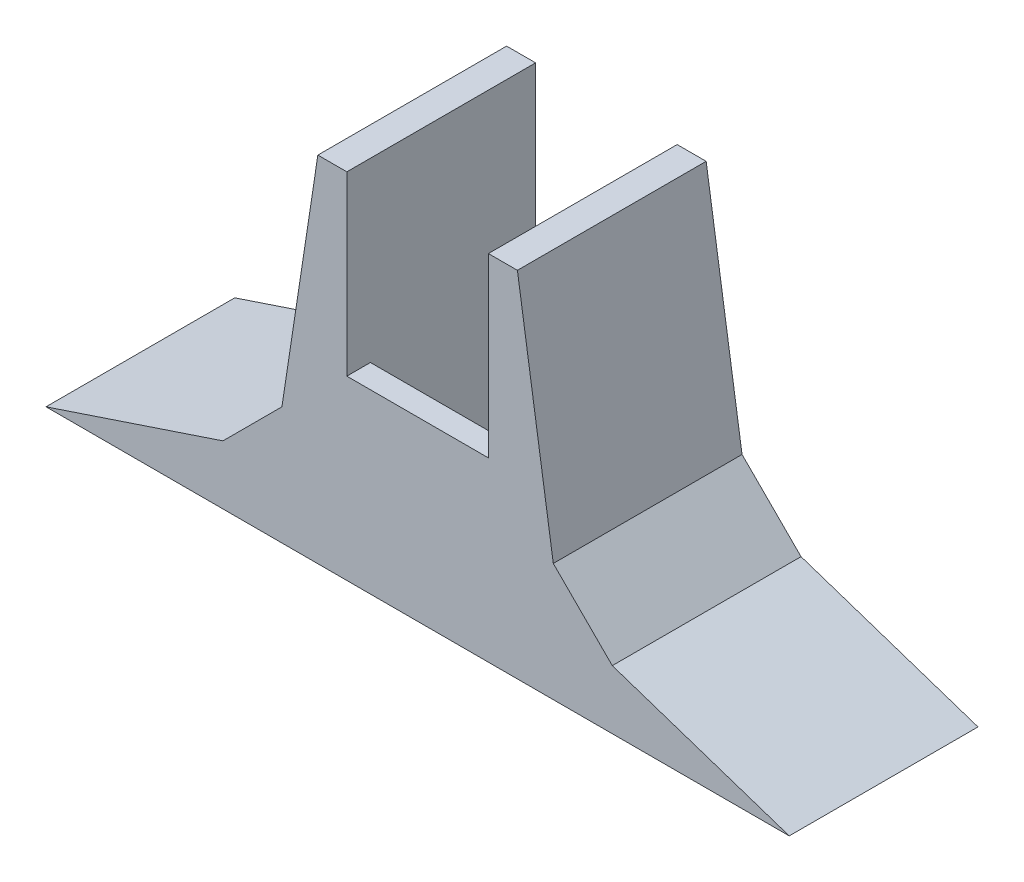
ISO-10303-21;
HEADER;
FILE_DESCRIPTION(('STEP AP214'),'2;1');
FILE_NAME('part.step','',(''),(''),'','','');
FILE_SCHEMA(('AUTOMOTIVE_DESIGN { 1 0 10303 214 1 1 1 1 }'));
ENDSEC;
DATA;
#1=APPLICATION_CONTEXT('core data for automotive mechanical design processes');
#2=APPLICATION_PROTOCOL_DEFINITION('international standard','automotive_design',2000,#1);
#3=PRODUCT_CONTEXT('',#1,'mechanical');
#4=PRODUCT('Part','Part','',(#3));
#5=PRODUCT_RELATED_PRODUCT_CATEGORY('part','',(#4));
#6=PRODUCT_DEFINITION_FORMATION('','',#4);
#7=PRODUCT_DEFINITION_CONTEXT('part definition',#1,'design');
#8=PRODUCT_DEFINITION('design','',#6,#7);
#9=PRODUCT_DEFINITION_SHAPE('','',#8);
#10=(LENGTH_UNIT() NAMED_UNIT(*) SI_UNIT(.MILLI.,.METRE.));
#11=(NAMED_UNIT(*) PLANE_ANGLE_UNIT() SI_UNIT($,.RADIAN.));
#12=(NAMED_UNIT(*) SI_UNIT($,.STERADIAN.) SOLID_ANGLE_UNIT());
#13=UNCERTAINTY_MEASURE_WITH_UNIT(LENGTH_MEASURE(1.E-05),#10,'distance_accuracy_value','');
#14=(GEOMETRIC_REPRESENTATION_CONTEXT(3) GLOBAL_UNCERTAINTY_ASSIGNED_CONTEXT((#13)) GLOBAL_UNIT_ASSIGNED_CONTEXT((#10,
#11,#12)) REPRESENTATION_CONTEXT('',''));
#15=CARTESIAN_POINT('',(0.,0.,0.));
#16=DIRECTION('',(0.,0.,1.));
#17=DIRECTION('',(1.,0.,0.));
#18=AXIS2_PLACEMENT_3D('',#15,#16,#17);
#19=CARTESIAN_POINT('',(-8.45753925141449,30.,16.));
#20=DIRECTION('',(0.,1.,0.));
#21=DIRECTION('',(0.,0.,1.));
#22=AXIS2_PLACEMENT_3D('',#19,#20,#21);
#23=PLANE('',#22);
#24=DIRECTION('',(1.,0.,0.));
#25=VECTOR('',#24,1.);
#26=CARTESIAN_POINT('',(-8.45753925141449,30.,16.));
#27=LINE('',#26,#25);
#28=CARTESIAN_POINT('',(-8.45753925141449,30.,16.));
#29=VERTEX_POINT('',#28);
#30=CARTESIAN_POINT('',(-6.,30.,16.));
#31=VERTEX_POINT('',#30);
#32=EDGE_CURVE('E242',#29,#31,#27,.T.);
#33=ORIENTED_EDGE('',*,*,#32,.T.);
#34=DIRECTION('',(0.,0.,-1.));
#35=VECTOR('',#34,1.);
#36=CARTESIAN_POINT('',(-6.,30.,14.));
#37=LINE('',#36,#35);
#38=CARTESIAN_POINT('',(-6.,30.,0.));
#39=VERTEX_POINT('',#38);
#40=EDGE_CURVE('E180',#31,#39,#37,.T.);
#41=ORIENTED_EDGE('',*,*,#40,.T.);
#42=DIRECTION('',(1.,0.,0.));
#43=VECTOR('',#42,1.);
#44=CARTESIAN_POINT('',(-8.45753925141449,30.,0.));
#45=LINE('',#44,#43);
#46=CARTESIAN_POINT('',(-8.45753925141449,30.,0.));
#47=VERTEX_POINT('',#46);
#48=EDGE_CURVE('E148',#47,#39,#45,.T.);
#49=ORIENTED_EDGE('',*,*,#48,.F.);
#50=DIRECTION('',(0.,0.,-1.));
#51=VECTOR('',#50,1.);
#52=CARTESIAN_POINT('',(-8.45753925141449,30.,16.));
#53=LINE('',#52,#51);
#54=EDGE_CURVE('E37',#29,#47,#53,.T.);
#55=ORIENTED_EDGE('',*,*,#54,.F.);
#56=EDGE_LOOP('',(#33,#41,#49,#55));
#57=FACE_BOUND('',#56,.T.);
#58=ADVANCED_FACE('F33',(#57),#23,.T.);
#59=CARTESIAN_POINT('',(0.,0.,16.));
#60=DIRECTION('',(0.,0.,-1.));
#61=DIRECTION('',(-1.,0.,0.));
#62=AXIS2_PLACEMENT_3D('',#59,#60,#61);
#63=PLANE('',#62);
#64=DIRECTION('',(0.,1.,0.));
#65=VECTOR('',#64,1.);
#66=CARTESIAN_POINT('',(-6.,0.,16.));
#67=LINE('',#66,#65);
#68=CARTESIAN_POINT('',(-6.,15.,16.));
#69=VERTEX_POINT('',#68);
#70=EDGE_CURVE('E237',#69,#31,#67,.T.);
#71=ORIENTED_EDGE('',*,*,#70,.T.);
#72=ORIENTED_EDGE('',*,*,#32,.F.);
#73=DIRECTION('',(0.150392838190402,0.988626316775472,0.));
#74=VECTOR('',#73,1.);
#75=CARTESIAN_POINT('',(-11.5,9.99999999999999,16.));
#76=LINE('',#75,#74);
#77=CARTESIAN_POINT('',(-11.5,9.99999999999999,16.));
#78=VERTEX_POINT('',#77);
#79=EDGE_CURVE('E163',#78,#29,#76,.T.);
#80=ORIENTED_EDGE('',*,*,#79,.F.);
#81=DIRECTION('',(0.707106781186548,0.707106781186547,0.));
#82=VECTOR('',#81,1.);
#83=CARTESIAN_POINT('',(-16.5,4.99999999999999,16.));
#84=LINE('',#83,#82);
#85=CARTESIAN_POINT('',(-16.5,4.99999999999999,16.));
#86=VERTEX_POINT('',#85);
#87=EDGE_CURVE('E132',#86,#78,#84,.T.);
#88=ORIENTED_EDGE('',*,*,#87,.F.);
#89=DIRECTION('',(0.948683298050514,0.316227766016838,0.));
#90=VECTOR('',#89,1.);
#91=CARTESIAN_POINT('',(-31.5,0.,16.));
#92=LINE('',#91,#90);
#93=CARTESIAN_POINT('',(-31.5,0.,16.));
#94=VERTEX_POINT('',#93);
#95=EDGE_CURVE('E117',#94,#86,#92,.T.);
#96=ORIENTED_EDGE('',*,*,#95,.F.);
#97=DIRECTION('',(-1.,0.,0.));
#98=VECTOR('',#97,1.);
#99=CARTESIAN_POINT('',(31.5,0.,16.));
#100=LINE('',#99,#98);
#101=CARTESIAN_POINT('',(31.5,0.,16.));
#102=VERTEX_POINT('',#101);
#103=EDGE_CURVE('E131',#102,#94,#100,.T.);
#104=ORIENTED_EDGE('',*,*,#103,.F.);
#105=DIRECTION('',(-0.948683298050514,0.316227766016838,0.));
#106=VECTOR('',#105,1.);
#107=CARTESIAN_POINT('',(31.5,0.,16.));
#108=LINE('',#107,#106);
#109=CARTESIAN_POINT('',(16.5,4.99999999999999,16.));
#110=VERTEX_POINT('',#109);
#111=EDGE_CURVE('E136',#102,#110,#108,.T.);
#112=ORIENTED_EDGE('',*,*,#111,.T.);
#113=DIRECTION('',(-0.707106781186548,0.707106781186547,0.));
#114=VECTOR('',#113,1.);
#115=CARTESIAN_POINT('',(16.5,4.99999999999999,16.));
#116=LINE('',#115,#114);
#117=CARTESIAN_POINT('',(11.5,9.99999999999999,16.));
#118=VERTEX_POINT('',#117);
#119=EDGE_CURVE('E138',#110,#118,#116,.T.);
#120=ORIENTED_EDGE('',*,*,#119,.T.);
#121=DIRECTION('',(-0.150392838190402,0.988626316775472,0.));
#122=VECTOR('',#121,1.);
#123=CARTESIAN_POINT('',(11.5,9.99999999999999,16.));
#124=LINE('',#123,#122);
#125=CARTESIAN_POINT('',(8.45753925141449,30.,16.));
#126=VERTEX_POINT('',#125);
#127=EDGE_CURVE('E241',#118,#126,#124,.T.);
#128=ORIENTED_EDGE('',*,*,#127,.T.);
#129=CARTESIAN_POINT('',(6.,30.,16.));
#130=VERTEX_POINT('',#129);
#131=EDGE_CURVE('E219',#130,#126,#27,.T.);
#132=ORIENTED_EDGE('',*,*,#131,.F.);
#133=DIRECTION('',(0.,1.,0.));
#134=VECTOR('',#133,1.);
#135=CARTESIAN_POINT('',(6.,0.,16.));
#136=LINE('',#135,#134);
#137=CARTESIAN_POINT('',(6.,15.,16.));
#138=VERTEX_POINT('',#137);
#139=EDGE_CURVE('E230',#138,#130,#136,.T.);
#140=ORIENTED_EDGE('',*,*,#139,.F.);
#141=DIRECTION('',(1.,0.,0.));
#142=VECTOR('',#141,1.);
#143=CARTESIAN_POINT('',(0.,15.,16.));
#144=LINE('',#143,#142);
#145=EDGE_CURVE('E238',#69,#138,#144,.T.);
#146=ORIENTED_EDGE('',*,*,#145,.F.);
#147=EDGE_LOOP('',(#71,#72,#80,#88,#96,#104,#112,#120,#128,#132,#140,#146));
#148=FACE_BOUND('',#147,.T.);
#149=ADVANCED_FACE('F130',(#148),#63,.F.);
#150=CARTESIAN_POINT('',(0.,0.,0.));
#151=DIRECTION('',(0.,0.,-1.));
#152=DIRECTION('',(-1.,0.,0.));
#153=AXIS2_PLACEMENT_3D('',#150,#151,#152);
#154=PLANE('',#153);
#155=ORIENTED_EDGE('',*,*,#48,.T.);
#156=DIRECTION('',(0.,-1.,0.));
#157=VECTOR('',#156,1.);
#158=CARTESIAN_POINT('',(-6.,0.,0.));
#159=LINE('',#158,#157);
#160=CARTESIAN_POINT('',(-6.,15.,0.));
#161=VERTEX_POINT('',#160);
#162=EDGE_CURVE('E226',#39,#161,#159,.T.);
#163=ORIENTED_EDGE('',*,*,#162,.T.);
#164=DIRECTION('',(-1.,0.,0.));
#165=VECTOR('',#164,1.);
#166=CARTESIAN_POINT('',(0.,15.,0.));
#167=LINE('',#166,#165);
#168=CARTESIAN_POINT('',(6.,15.,0.));
#169=VERTEX_POINT('',#168);
#170=EDGE_CURVE('E258',#169,#161,#167,.T.);
#171=ORIENTED_EDGE('',*,*,#170,.F.);
#172=DIRECTION('',(0.,-1.,0.));
#173=VECTOR('',#172,1.);
#174=CARTESIAN_POINT('',(6.,0.,0.));
#175=LINE('',#174,#173);
#176=CARTESIAN_POINT('',(6.,30.,0.));
#177=VERTEX_POINT('',#176);
#178=EDGE_CURVE('E255',#177,#169,#175,.T.);
#179=ORIENTED_EDGE('',*,*,#178,.F.);
#180=CARTESIAN_POINT('',(8.45753925141449,30.,0.));
#181=VERTEX_POINT('',#180);
#182=EDGE_CURVE('E146',#177,#181,#45,.T.);
#183=ORIENTED_EDGE('',*,*,#182,.T.);
#184=DIRECTION('',(-0.150392838190402,0.988626316775472,0.));
#185=VECTOR('',#184,1.);
#186=CARTESIAN_POINT('',(11.5,9.99999999999999,0.));
#187=LINE('',#186,#185);
#188=CARTESIAN_POINT('',(11.5,9.99999999999999,0.));
#189=VERTEX_POINT('',#188);
#190=EDGE_CURVE('E151',#189,#181,#187,.T.);
#191=ORIENTED_EDGE('',*,*,#190,.F.);
#192=DIRECTION('',(-0.707106781186548,0.707106781186547,0.));
#193=VECTOR('',#192,1.);
#194=CARTESIAN_POINT('',(16.5,4.99999999999999,0.));
#195=LINE('',#194,#193);
#196=CARTESIAN_POINT('',(16.5,4.99999999999999,0.));
#197=VERTEX_POINT('',#196);
#198=EDGE_CURVE('E154',#197,#189,#195,.T.);
#199=ORIENTED_EDGE('',*,*,#198,.F.);
#200=DIRECTION('',(-0.948683298050514,0.316227766016838,0.));
#201=VECTOR('',#200,1.);
#202=CARTESIAN_POINT('',(31.5,0.,0.));
#203=LINE('',#202,#201);
#204=CARTESIAN_POINT('',(31.5,0.,0.));
#205=VERTEX_POINT('',#204);
#206=EDGE_CURVE('E156',#205,#197,#203,.T.);
#207=ORIENTED_EDGE('',*,*,#206,.F.);
#208=DIRECTION('',(-1.,0.,0.));
#209=VECTOR('',#208,1.);
#210=CARTESIAN_POINT('',(31.5,0.,0.));
#211=LINE('',#210,#209);
#212=CARTESIAN_POINT('',(-31.5,0.,0.));
#213=VERTEX_POINT('',#212);
#214=EDGE_CURVE('E158',#205,#213,#211,.T.);
#215=ORIENTED_EDGE('',*,*,#214,.T.);
#216=DIRECTION('',(0.948683298050514,0.316227766016838,0.));
#217=VECTOR('',#216,1.);
#218=CARTESIAN_POINT('',(-31.5,0.,0.));
#219=LINE('',#218,#217);
#220=CARTESIAN_POINT('',(-16.5,4.99999999999999,0.));
#221=VERTEX_POINT('',#220);
#222=EDGE_CURVE('E120',#213,#221,#219,.T.);
#223=ORIENTED_EDGE('',*,*,#222,.T.);
#224=DIRECTION('',(0.707106781186548,0.707106781186547,0.));
#225=VECTOR('',#224,1.);
#226=CARTESIAN_POINT('',(-16.5,4.99999999999999,0.));
#227=LINE('',#226,#225);
#228=CARTESIAN_POINT('',(-11.5,9.99999999999999,0.));
#229=VERTEX_POINT('',#228);
#230=EDGE_CURVE('E161',#221,#229,#227,.T.);
#231=ORIENTED_EDGE('',*,*,#230,.T.);
#232=DIRECTION('',(0.150392838190402,0.988626316775472,0.));
#233=VECTOR('',#232,1.);
#234=CARTESIAN_POINT('',(-11.5,9.99999999999999,0.));
#235=LINE('',#234,#233);
#236=EDGE_CURVE('E143',#229,#47,#235,.T.);
#237=ORIENTED_EDGE('',*,*,#236,.T.);
#238=EDGE_LOOP('',(#155,#163,#171,#179,#183,#191,#199,#207,#215,#223,#231,#237));
#239=FACE_BOUND('',#238,.T.);
#240=ADVANCED_FACE('F184',(#239),#154,.T.);
#241=CARTESIAN_POINT('',(-11.5,9.99999999999999,16.));
#242=DIRECTION('',(-0.988626316775472,0.150392838190402,0.));
#243=DIRECTION('',(-0.150392838190402,-0.988626316775472,0.));
#244=AXIS2_PLACEMENT_3D('',#241,#242,#243);
#245=PLANE('',#244);
#246=ORIENTED_EDGE('',*,*,#236,.F.);
#247=DIRECTION('',(0.,0.,-1.));
#248=VECTOR('',#247,1.);
#249=CARTESIAN_POINT('',(-11.5,9.99999999999999,16.));
#250=LINE('',#249,#248);
#251=EDGE_CURVE('E11',#78,#229,#250,.T.);
#252=ORIENTED_EDGE('',*,*,#251,.F.);
#253=ORIENTED_EDGE('',*,*,#79,.T.);
#254=ORIENTED_EDGE('',*,*,#54,.T.);
#255=EDGE_LOOP('',(#246,#252,#253,#254));
#256=FACE_BOUND('',#255,.T.);
#257=ADVANCED_FACE('F35',(#256),#245,.T.);
#258=CARTESIAN_POINT('',(-16.5,4.99999999999999,16.));
#259=DIRECTION('',(-0.707106781186547,0.707106781186548,0.));
#260=DIRECTION('',(-0.707106781186548,-0.707106781186547,0.));
#261=AXIS2_PLACEMENT_3D('',#258,#259,#260);
#262=PLANE('',#261);
#263=ORIENTED_EDGE('',*,*,#230,.F.);
#264=DIRECTION('',(0.,0.,-1.));
#265=VECTOR('',#264,1.);
#266=CARTESIAN_POINT('',(-16.5,4.99999999999999,16.));
#267=LINE('',#266,#265);
#268=EDGE_CURVE('E42',#86,#221,#267,.T.);
#269=ORIENTED_EDGE('',*,*,#268,.F.);
#270=ORIENTED_EDGE('',*,*,#87,.T.);
#271=ORIENTED_EDGE('',*,*,#251,.T.);
#272=EDGE_LOOP('',(#263,#269,#270,#271));
#273=FACE_BOUND('',#272,.T.);
#274=ADVANCED_FACE('F185',(#273),#262,.T.);
#275=CARTESIAN_POINT('',(-31.5,0.,16.));
#276=DIRECTION('',(-0.316227766016838,0.948683298050514,0.));
#277=DIRECTION('',(-0.948683298050514,-0.316227766016838,0.));
#278=AXIS2_PLACEMENT_3D('',#275,#276,#277);
#279=PLANE('',#278);
#280=ORIENTED_EDGE('',*,*,#222,.F.);
#281=DIRECTION('',(0.,0.,-1.));
#282=VECTOR('',#281,1.);
#283=CARTESIAN_POINT('',(-31.5,0.,16.));
#284=LINE('',#283,#282);
#285=EDGE_CURVE('E114',#94,#213,#284,.T.);
#286=ORIENTED_EDGE('',*,*,#285,.F.);
#287=ORIENTED_EDGE('',*,*,#95,.T.);
#288=ORIENTED_EDGE('',*,*,#268,.T.);
#289=EDGE_LOOP('',(#280,#286,#287,#288));
#290=FACE_BOUND('',#289,.T.);
#291=ADVANCED_FACE('F116',(#290),#279,.T.);
#292=CARTESIAN_POINT('',(31.5,0.,16.));
#293=DIRECTION('',(0.,-1.,0.));
#294=DIRECTION('',(0.,0.,-1.));
#295=AXIS2_PLACEMENT_3D('',#292,#293,#294);
#296=PLANE('',#295);
#297=ORIENTED_EDGE('',*,*,#214,.F.);
#298=DIRECTION('',(0.,0.,-1.));
#299=VECTOR('',#298,1.);
#300=CARTESIAN_POINT('',(31.5,0.,16.));
#301=LINE('',#300,#299);
#302=EDGE_CURVE('E125',#102,#205,#301,.T.);
#303=ORIENTED_EDGE('',*,*,#302,.F.);
#304=ORIENTED_EDGE('',*,*,#103,.T.);
#305=ORIENTED_EDGE('',*,*,#285,.T.);
#306=EDGE_LOOP('',(#297,#303,#304,#305));
#307=FACE_BOUND('',#306,.T.);
#308=ADVANCED_FACE('F134',(#307),#296,.T.);
#309=CARTESIAN_POINT('',(31.5,0.,16.));
#310=DIRECTION('',(-0.316227766016838,-0.948683298050514,0.));
#311=DIRECTION('',(0.948683298050514,-0.316227766016838,0.));
#312=AXIS2_PLACEMENT_3D('',#309,#310,#311);
#313=PLANE('',#312);
#314=ORIENTED_EDGE('',*,*,#206,.T.);
#315=DIRECTION('',(0.,0.,-1.));
#316=VECTOR('',#315,1.);
#317=CARTESIAN_POINT('',(16.5,4.99999999999999,16.));
#318=LINE('',#317,#316);
#319=EDGE_CURVE('E167',#110,#197,#318,.T.);
#320=ORIENTED_EDGE('',*,*,#319,.F.);
#321=ORIENTED_EDGE('',*,*,#111,.F.);
#322=ORIENTED_EDGE('',*,*,#302,.T.);
#323=EDGE_LOOP('',(#314,#320,#321,#322));
#324=FACE_BOUND('',#323,.T.);
#325=ADVANCED_FACE('F379',(#324),#313,.F.);
#326=CARTESIAN_POINT('',(16.5,4.99999999999999,16.));
#327=DIRECTION('',(-0.707106781186547,-0.707106781186548,0.));
#328=DIRECTION('',(0.707106781186548,-0.707106781186547,0.));
#329=AXIS2_PLACEMENT_3D('',#326,#327,#328);
#330=PLANE('',#329);
#331=ORIENTED_EDGE('',*,*,#198,.T.);
#332=DIRECTION('',(0.,0.,-1.));
#333=VECTOR('',#332,1.);
#334=CARTESIAN_POINT('',(11.5,9.99999999999999,16.));
#335=LINE('',#334,#333);
#336=EDGE_CURVE('E170',#118,#189,#335,.T.);
#337=ORIENTED_EDGE('',*,*,#336,.F.);
#338=ORIENTED_EDGE('',*,*,#119,.F.);
#339=ORIENTED_EDGE('',*,*,#319,.T.);
#340=EDGE_LOOP('',(#331,#337,#338,#339));
#341=FACE_BOUND('',#340,.T.);
#342=ADVANCED_FACE('F211',(#341),#330,.F.);
#343=CARTESIAN_POINT('',(11.5,9.99999999999999,16.));
#344=DIRECTION('',(-0.988626316775472,-0.150392838190402,0.));
#345=DIRECTION('',(0.150392838190402,-0.988626316775472,0.));
#346=AXIS2_PLACEMENT_3D('',#343,#344,#345);
#347=PLANE('',#346);
#348=ORIENTED_EDGE('',*,*,#190,.T.);
#349=DIRECTION('',(0.,0.,-1.));
#350=VECTOR('',#349,1.);
#351=CARTESIAN_POINT('',(8.45753925141449,30.,16.));
#352=LINE('',#351,#350);
#353=EDGE_CURVE('E172',#126,#181,#352,.T.);
#354=ORIENTED_EDGE('',*,*,#353,.F.);
#355=ORIENTED_EDGE('',*,*,#127,.F.);
#356=ORIENTED_EDGE('',*,*,#336,.T.);
#357=EDGE_LOOP('',(#348,#354,#355,#356));
#358=FACE_BOUND('',#357,.T.);
#359=ADVANCED_FACE('F203',(#358),#347,.F.);
#360=DIRECTION('',(0.,0.,-1.));
#361=VECTOR('',#360,1.);
#362=CARTESIAN_POINT('',(6.,30.,14.));
#363=LINE('',#362,#361);
#364=EDGE_CURVE('E216',#130,#177,#363,.T.);
#365=ORIENTED_EDGE('',*,*,#364,.F.);
#366=ORIENTED_EDGE('',*,*,#131,.T.);
#367=ORIENTED_EDGE('',*,*,#353,.T.);
#368=ORIENTED_EDGE('',*,*,#182,.F.);
#369=EDGE_LOOP('',(#365,#366,#367,#368));
#370=FACE_BOUND('',#369,.T.);
#371=ADVANCED_FACE('F195',(#370),#23,.T.);
#372=CARTESIAN_POINT('',(-6.,5.,14.));
#373=DIRECTION('',(0.,0.,1.));
#374=DIRECTION('',(1.,0.,0.));
#375=AXIS2_PLACEMENT_3D('',#372,#373,#374);
#376=PLANE('',#375);
#377=DIRECTION('',(0.,1.,0.));
#378=VECTOR('',#377,1.);
#379=CARTESIAN_POINT('',(-6.,5.,14.));
#380=LINE('',#379,#378);
#381=CARTESIAN_POINT('',(-6.,5.,14.));
#382=VERTEX_POINT('',#381);
#383=CARTESIAN_POINT('',(-6.,15.,14.));
#384=VERTEX_POINT('',#383);
#385=EDGE_CURVE('E147',#382,#384,#380,.T.);
#386=ORIENTED_EDGE('',*,*,#385,.T.);
#387=DIRECTION('',(1.,0.,0.));
#388=VECTOR('',#387,1.);
#389=CARTESIAN_POINT('',(-6.,15.,14.));
#390=LINE('',#389,#388);
#391=CARTESIAN_POINT('',(6.,15.,14.));
#392=VERTEX_POINT('',#391);
#393=EDGE_CURVE('E263',#384,#392,#390,.T.);
#394=ORIENTED_EDGE('',*,*,#393,.T.);
#395=DIRECTION('',(0.,1.,0.));
#396=VECTOR('',#395,1.);
#397=CARTESIAN_POINT('',(6.,5.,14.));
#398=LINE('',#397,#396);
#399=CARTESIAN_POINT('',(6.,5.,14.));
#400=VERTEX_POINT('',#399);
#401=EDGE_CURVE('E278',#400,#392,#398,.T.);
#402=ORIENTED_EDGE('',*,*,#401,.F.);
#403=DIRECTION('',(1.,0.,0.));
#404=VECTOR('',#403,1.);
#405=CARTESIAN_POINT('',(-6.,5.,14.));
#406=LINE('',#405,#404);
#407=EDGE_CURVE('E267',#382,#400,#406,.T.);
#408=ORIENTED_EDGE('',*,*,#407,.F.);
#409=EDGE_LOOP('',(#386,#394,#402,#408));
#410=FACE_BOUND('',#409,.T.);
#411=ADVANCED_FACE('F202',(#410),#376,.F.);
#412=CARTESIAN_POINT('',(-6.,5.,14.));
#413=DIRECTION('',(1.,0.,0.));
#414=DIRECTION('',(0.,0.,-1.));
#415=AXIS2_PLACEMENT_3D('',#412,#413,#414);
#416=PLANE('',#415);
#417=DIRECTION('',(0.,1.,0.));
#418=VECTOR('',#417,1.);
#419=CARTESIAN_POINT('',(-6.,5.,2.));
#420=LINE('',#419,#418);
#421=CARTESIAN_POINT('',(-6.,5.,2.));
#422=VERTEX_POINT('',#421);
#423=CARTESIAN_POINT('',(-6.,15.,2.));
#424=VERTEX_POINT('',#423);
#425=EDGE_CURVE('E283',#422,#424,#420,.T.);
#426=ORIENTED_EDGE('',*,*,#425,.T.);
#427=DIRECTION('',(0.,0.,1.));
#428=VECTOR('',#427,1.);
#429=CARTESIAN_POINT('',(-6.,15.,-9.));
#430=LINE('',#429,#428);
#431=EDGE_CURVE('E321',#161,#424,#430,.T.);
#432=ORIENTED_EDGE('',*,*,#431,.F.);
#433=ORIENTED_EDGE('',*,*,#162,.F.);
#434=ORIENTED_EDGE('',*,*,#40,.F.);
#435=ORIENTED_EDGE('',*,*,#70,.F.);
#436=EDGE_CURVE('E309',#384,#69,#430,.T.);
#437=ORIENTED_EDGE('',*,*,#436,.F.);
#438=ORIENTED_EDGE('',*,*,#385,.F.);
#439=DIRECTION('',(0.,0.,-1.));
#440=VECTOR('',#439,1.);
#441=CARTESIAN_POINT('',(-6.,5.,14.));
#442=LINE('',#441,#440);
#443=EDGE_CURVE('E276',#382,#422,#442,.T.);
#444=ORIENTED_EDGE('',*,*,#443,.T.);
#445=EDGE_LOOP('',(#426,#432,#433,#434,#435,#437,#438,#444));
#446=FACE_BOUND('',#445,.T.);
#447=ADVANCED_FACE('F208',(#446),#416,.T.);
#448=CARTESIAN_POINT('',(-6.,5.,2.));
#449=DIRECTION('',(0.,0.,1.));
#450=DIRECTION('',(1.,0.,0.));
#451=AXIS2_PLACEMENT_3D('',#448,#449,#450);
#452=PLANE('',#451);
#453=DIRECTION('',(1.,0.,0.));
#454=VECTOR('',#453,1.);
#455=CARTESIAN_POINT('',(-6.,15.,2.));
#456=LINE('',#455,#454);
#457=CARTESIAN_POINT('',(6.,15.,2.));
#458=VERTEX_POINT('',#457);
#459=EDGE_CURVE('E317',#424,#458,#456,.T.);
#460=ORIENTED_EDGE('',*,*,#459,.F.);
#461=ORIENTED_EDGE('',*,*,#425,.F.);
#462=DIRECTION('',(1.,0.,0.));
#463=VECTOR('',#462,1.);
#464=CARTESIAN_POINT('',(-6.,5.,2.));
#465=LINE('',#464,#463);
#466=CARTESIAN_POINT('',(6.,5.,2.));
#467=VERTEX_POINT('',#466);
#468=EDGE_CURVE('E273',#422,#467,#465,.T.);
#469=ORIENTED_EDGE('',*,*,#468,.T.);
#470=DIRECTION('',(0.,1.,0.));
#471=VECTOR('',#470,1.);
#472=CARTESIAN_POINT('',(6.,5.,2.));
#473=LINE('',#472,#471);
#474=EDGE_CURVE('E286',#467,#458,#473,.T.);
#475=ORIENTED_EDGE('',*,*,#474,.T.);
#476=EDGE_LOOP('',(#460,#461,#469,#475));
#477=FACE_BOUND('',#476,.T.);
#478=ADVANCED_FACE('F315',(#477),#452,.T.);
#479=CARTESIAN_POINT('',(6.,5.,14.));
#480=DIRECTION('',(1.,0.,0.));
#481=DIRECTION('',(0.,0.,-1.));
#482=AXIS2_PLACEMENT_3D('',#479,#480,#481);
#483=PLANE('',#482);
#484=ORIENTED_EDGE('',*,*,#401,.T.);
#485=DIRECTION('',(0.,0.,1.));
#486=VECTOR('',#485,1.);
#487=CARTESIAN_POINT('',(6.,15.,-9.));
#488=LINE('',#487,#486);
#489=EDGE_CURVE('E234',#392,#138,#488,.T.);
#490=ORIENTED_EDGE('',*,*,#489,.T.);
#491=ORIENTED_EDGE('',*,*,#139,.T.);
#492=ORIENTED_EDGE('',*,*,#364,.T.);
#493=ORIENTED_EDGE('',*,*,#178,.T.);
#494=EDGE_CURVE('E50',#169,#458,#488,.T.);
#495=ORIENTED_EDGE('',*,*,#494,.T.);
#496=ORIENTED_EDGE('',*,*,#474,.F.);
#497=DIRECTION('',(0.,0.,-1.));
#498=VECTOR('',#497,1.);
#499=CARTESIAN_POINT('',(6.,5.,14.));
#500=LINE('',#499,#498);
#501=EDGE_CURVE('E270',#400,#467,#500,.T.);
#502=ORIENTED_EDGE('',*,*,#501,.F.);
#503=EDGE_LOOP('',(#484,#490,#491,#492,#493,#495,#496,#502));
#504=FACE_BOUND('',#503,.T.);
#505=ADVANCED_FACE('F232',(#504),#483,.F.);
#506=CARTESIAN_POINT('',(0.,5.,0.));
#507=DIRECTION('',(0.,1.,0.));
#508=DIRECTION('',(0.,0.,1.));
#509=AXIS2_PLACEMENT_3D('',#506,#507,#508);
#510=PLANE('',#509);
#511=ORIENTED_EDGE('',*,*,#407,.T.);
#512=ORIENTED_EDGE('',*,*,#501,.T.);
#513=ORIENTED_EDGE('',*,*,#468,.F.);
#514=ORIENTED_EDGE('',*,*,#443,.F.);
#515=EDGE_LOOP('',(#511,#512,#513,#514));
#516=FACE_BOUND('',#515,.T.);
#517=ADVANCED_FACE('F312',(#516),#510,.T.);
#518=CARTESIAN_POINT('',(0.,15.,-9.));
#519=DIRECTION('',(0.,-1.,0.));
#520=DIRECTION('',(1.,0.,0.));
#521=AXIS2_PLACEMENT_3D('',#518,#519,#520);
#522=PLANE('',#521);
#523=ORIENTED_EDGE('',*,*,#170,.T.);
#524=ORIENTED_EDGE('',*,*,#431,.T.);
#525=ORIENTED_EDGE('',*,*,#459,.T.);
#526=ORIENTED_EDGE('',*,*,#494,.F.);
#527=EDGE_LOOP('',(#523,#524,#525,#526));
#528=FACE_BOUND('',#527,.T.);
#529=ADVANCED_FACE('F335',(#528),#522,.F.);
#530=ORIENTED_EDGE('',*,*,#436,.T.);
#531=ORIENTED_EDGE('',*,*,#145,.T.);
#532=ORIENTED_EDGE('',*,*,#489,.F.);
#533=ORIENTED_EDGE('',*,*,#393,.F.);
#534=EDGE_LOOP('',(#530,#531,#532,#533));
#535=FACE_BOUND('',#534,.T.);
#536=ADVANCED_FACE('F337',(#535),#522,.F.);
#537=CLOSED_SHELL('',(#58,#149,#240,#257,#274,#291,#308,#325,#342,#359,#371,#411,#447,#478,#505,
#517,#529,#536));
#538=MANIFOLD_SOLID_BREP('B2',#537);
#539=ADVANCED_BREP_SHAPE_REPRESENTATION('',(#18,#538),#14);
#540=SHAPE_DEFINITION_REPRESENTATION(#9,#539);
ENDSEC;
END-ISO-10303-21;
